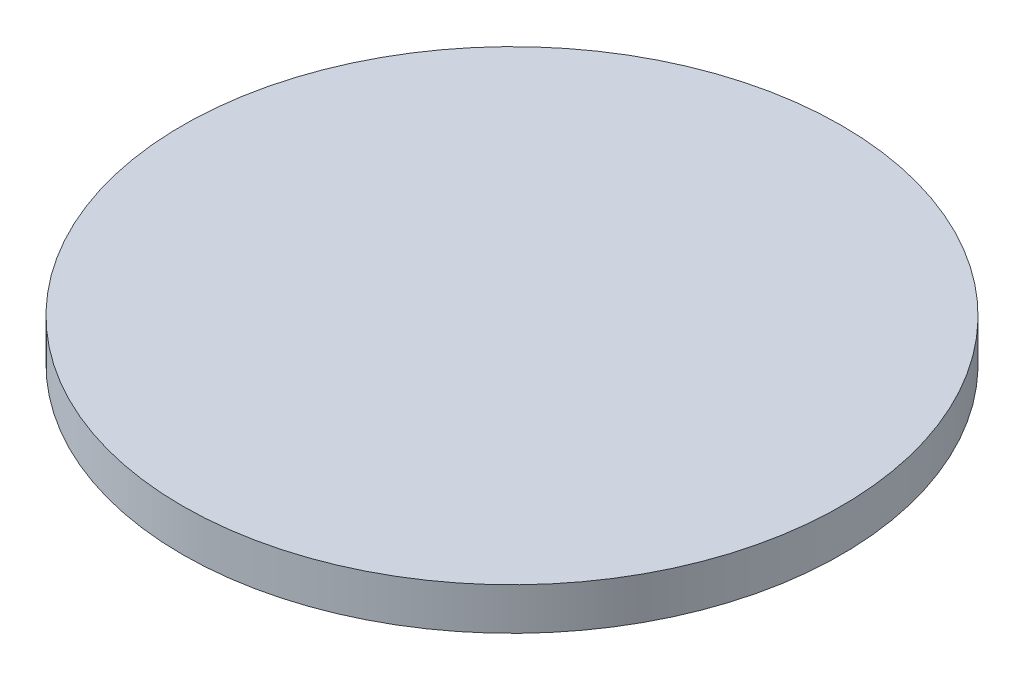
ISO-10303-21;
HEADER;
FILE_DESCRIPTION(('STEP AP214'),'2;1');
FILE_NAME('part.step','',(''),(''),'','','');
FILE_SCHEMA(('AUTOMOTIVE_DESIGN { 1 0 10303 214 1 1 1 1 }'));
ENDSEC;
DATA;
#1=APPLICATION_CONTEXT('core data for automotive mechanical design processes');
#2=APPLICATION_PROTOCOL_DEFINITION('international standard','automotive_design',2000,#1);
#3=PRODUCT_CONTEXT('',#1,'mechanical');
#4=PRODUCT('Part','Part','',(#3));
#5=PRODUCT_RELATED_PRODUCT_CATEGORY('part','',(#4));
#6=PRODUCT_DEFINITION_FORMATION('','',#4);
#7=PRODUCT_DEFINITION_CONTEXT('part definition',#1,'design');
#8=PRODUCT_DEFINITION('design','',#6,#7);
#9=PRODUCT_DEFINITION_SHAPE('','',#8);
#10=(LENGTH_UNIT() NAMED_UNIT(*) SI_UNIT(.MILLI.,.METRE.));
#11=(NAMED_UNIT(*) PLANE_ANGLE_UNIT() SI_UNIT($,.RADIAN.));
#12=(NAMED_UNIT(*) SI_UNIT($,.STERADIAN.) SOLID_ANGLE_UNIT());
#13=UNCERTAINTY_MEASURE_WITH_UNIT(LENGTH_MEASURE(1.E-05),#10,'distance_accuracy_value','');
#14=(GEOMETRIC_REPRESENTATION_CONTEXT(3) GLOBAL_UNCERTAINTY_ASSIGNED_CONTEXT((#13)) GLOBAL_UNIT_ASSIGNED_CONTEXT((#10,
#11,#12)) REPRESENTATION_CONTEXT('',''));
#15=CARTESIAN_POINT('',(0.,0.,0.));
#16=DIRECTION('',(0.,0.,1.));
#17=DIRECTION('',(1.,0.,0.));
#18=AXIS2_PLACEMENT_3D('',#15,#16,#17);
#19=CARTESIAN_POINT('',(0.,-140.,105.));
#20=DIRECTION('',(0.,1.,0.));
#21=DIRECTION('',(1.,0.,0.));
#22=AXIS2_PLACEMENT_3D('',#19,#20,#21);
#23=PLANE('',#22);
#24=CARTESIAN_POINT('',(0.,-140.,105.));
#25=DIRECTION('',(0.,1.,0.));
#26=DIRECTION('',(0.,0.,1.));
#27=AXIS2_PLACEMENT_3D('',#24,#25,#26);
#28=CIRCLE('',#27,47.);
#29=CARTESIAN_POINT('',(0.,-140.,152.));
#30=VERTEX_POINT('',#29);
#31=EDGE_CURVE('E10',#30,#30,#28,.T.);
#32=ORIENTED_EDGE('',*,*,#31,.F.);
#33=EDGE_LOOP('',(#32));
#34=FACE_BOUND('',#33,.T.);
#35=ADVANCED_FACE('F16',(#34),#23,.F.);
#36=CARTESIAN_POINT('',(0.,-134.,105.));
#37=DIRECTION('',(0.,1.,0.));
#38=DIRECTION('',(1.,0.,0.));
#39=AXIS2_PLACEMENT_3D('',#36,#37,#38);
#40=PLANE('',#39);
#41=CARTESIAN_POINT('',(0.,-134.,105.));
#42=DIRECTION('',(0.,1.,0.));
#43=DIRECTION('',(0.,0.,1.));
#44=AXIS2_PLACEMENT_3D('',#41,#42,#43);
#45=CIRCLE('',#44,47.);
#46=CARTESIAN_POINT('',(0.,-134.,152.));
#47=VERTEX_POINT('',#46);
#48=EDGE_CURVE('E40',#47,#47,#45,.T.);
#49=ORIENTED_EDGE('',*,*,#48,.T.);
#50=EDGE_LOOP('',(#49));
#51=FACE_BOUND('',#50,.T.);
#52=ADVANCED_FACE('F44',(#51),#40,.T.);
#53=CARTESIAN_POINT('',(0.,-140.,105.));
#54=DIRECTION('',(0.,1.,0.));
#55=DIRECTION('',(0.,0.,1.));
#56=AXIS2_PLACEMENT_3D('',#53,#54,#55);
#57=CYLINDRICAL_SURFACE('',#56,47.);
#58=ORIENTED_EDGE('',*,*,#48,.F.);
#59=DIRECTION('',(0.,1.,0.));
#60=VECTOR('',#59,1.);
#61=CARTESIAN_POINT('',(0.,-140.,152.));
#62=LINE('',#61,#60);
#63=EDGE_CURVE('E24',#30,#47,#62,.T.);
#64=ORIENTED_EDGE('',*,*,#63,.F.);
#65=ORIENTED_EDGE('',*,*,#31,.T.);
#66=ORIENTED_EDGE('',*,*,#63,.T.);
#67=EDGE_LOOP('',(#58,#64,#65,#66));
#68=FACE_BOUND('',#67,.T.);
#69=ADVANCED_FACE('F39',(#68),#57,.T.);
#70=CLOSED_SHELL('',(#35,#52,#69));
#71=MANIFOLD_SOLID_BREP('B1',#70);
#72=ADVANCED_BREP_SHAPE_REPRESENTATION('',(#18,#71),#14);
#73=SHAPE_DEFINITION_REPRESENTATION(#9,#72);
ENDSEC;
END-ISO-10303-21;
